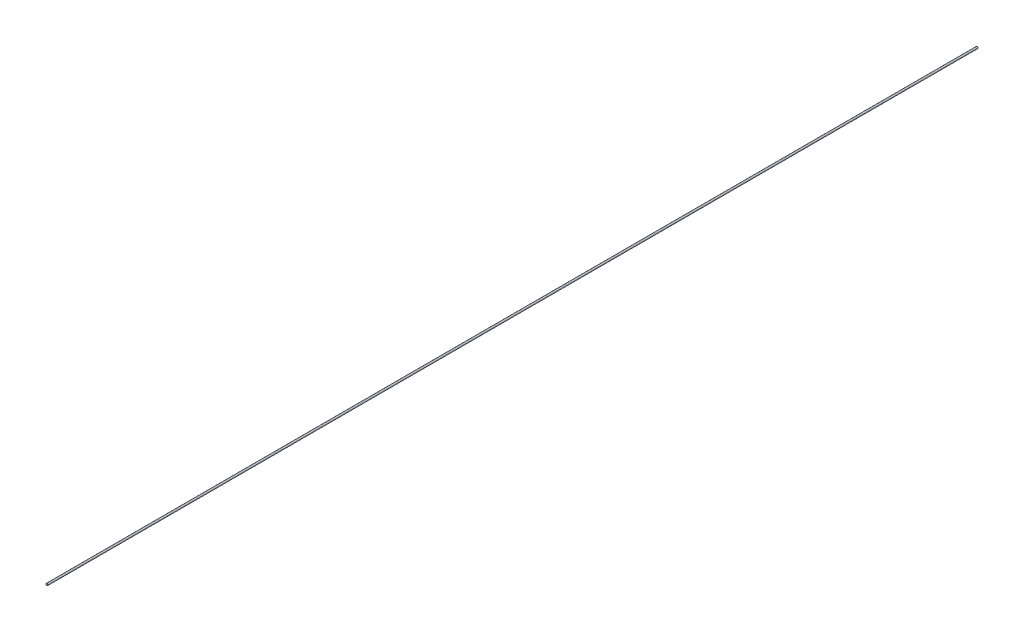
ISO-10303-21;
HEADER;
FILE_DESCRIPTION(('STEP AP214'),'2;1');
FILE_NAME('part.step','',(''),(''),'','','');
FILE_SCHEMA(('AUTOMOTIVE_DESIGN { 1 0 10303 214 1 1 1 1 }'));
ENDSEC;
DATA;
#1=APPLICATION_CONTEXT('core data for automotive mechanical design processes');
#2=APPLICATION_PROTOCOL_DEFINITION('international standard','automotive_design',2000,#1);
#3=PRODUCT_CONTEXT('',#1,'mechanical');
#4=PRODUCT('Part','Part','',(#3));
#5=PRODUCT_RELATED_PRODUCT_CATEGORY('part','',(#4));
#6=PRODUCT_DEFINITION_FORMATION('','',#4);
#7=PRODUCT_DEFINITION_CONTEXT('part definition',#1,'design');
#8=PRODUCT_DEFINITION('design','',#6,#7);
#9=PRODUCT_DEFINITION_SHAPE('','',#8);
#10=(LENGTH_UNIT() NAMED_UNIT(*) SI_UNIT(.MILLI.,.METRE.));
#11=(NAMED_UNIT(*) PLANE_ANGLE_UNIT() SI_UNIT($,.RADIAN.));
#12=(NAMED_UNIT(*) SI_UNIT($,.STERADIAN.) SOLID_ANGLE_UNIT());
#13=UNCERTAINTY_MEASURE_WITH_UNIT(LENGTH_MEASURE(1.E-05),#10,'distance_accuracy_value','');
#14=(GEOMETRIC_REPRESENTATION_CONTEXT(3) GLOBAL_UNCERTAINTY_ASSIGNED_CONTEXT((#13)) GLOBAL_UNIT_ASSIGNED_CONTEXT((#10,
#11,#12)) REPRESENTATION_CONTEXT('',''));
#15=CARTESIAN_POINT('',(0.,0.,0.));
#16=DIRECTION('',(0.,0.,1.));
#17=DIRECTION('',(1.,0.,0.));
#18=AXIS2_PLACEMENT_3D('',#15,#16,#17);
#19=CARTESIAN_POINT('',(0.,0.,40.));
#20=DIRECTION('',(0.,0.,-1.));
#21=DIRECTION('',(-1.,0.,0.));
#22=AXIS2_PLACEMENT_3D('',#19,#20,#21);
#23=CYLINDRICAL_SURFACE('',#22,0.04);
#24=CARTESIAN_POINT('',(0.,0.,40.));
#25=DIRECTION('',(0.,0.,1.));
#26=DIRECTION('',(1.,0.,0.));
#27=AXIS2_PLACEMENT_3D('',#24,#25,#26);
#28=CIRCLE('',#27,0.04);
#29=CARTESIAN_POINT('',(0.04,0.,40.));
#30=VERTEX_POINT('',#29);
#31=EDGE_CURVE('E10',#30,#30,#28,.T.);
#32=ORIENTED_EDGE('',*,*,#31,.F.);
#33=EDGE_LOOP('',(#32));
#34=FACE_BOUND('',#33,.T.);
#35=CARTESIAN_POINT('',(0.,0.,0.));
#36=DIRECTION('',(0.,0.,1.));
#37=DIRECTION('',(1.,0.,0.));
#38=AXIS2_PLACEMENT_3D('',#35,#36,#37);
#39=CIRCLE('',#38,0.04);
#40=CARTESIAN_POINT('',(0.04,0.,0.));
#41=VERTEX_POINT('',#40);
#42=EDGE_CURVE('E38',#41,#41,#39,.T.);
#43=ORIENTED_EDGE('',*,*,#42,.T.);
#44=EDGE_LOOP('',(#43));
#45=FACE_BOUND('',#44,.T.);
#46=ADVANCED_FACE('F35',(#34,#45),#23,.T.);
#47=CARTESIAN_POINT('',(0.,0.,40.));
#48=DIRECTION('',(0.,0.,1.));
#49=DIRECTION('',(1.,0.,0.));
#50=AXIS2_PLACEMENT_3D('',#47,#48,#49);
#51=PLANE('',#50);
#52=ORIENTED_EDGE('',*,*,#31,.T.);
#53=EDGE_LOOP('',(#52));
#54=FACE_BOUND('',#53,.T.);
#55=ADVANCED_FACE('F50',(#54),#51,.T.);
#56=CARTESIAN_POINT('',(0.,0.,0.));
#57=DIRECTION('',(0.,0.,1.));
#58=DIRECTION('',(1.,0.,0.));
#59=AXIS2_PLACEMENT_3D('',#56,#57,#58);
#60=PLANE('',#59);
#61=ORIENTED_EDGE('',*,*,#42,.F.);
#62=EDGE_LOOP('',(#61));
#63=FACE_BOUND('',#62,.T.);
#64=ADVANCED_FACE('F48',(#63),#60,.F.);
#65=CLOSED_SHELL('',(#46,#55,#64));
#66=MANIFOLD_SOLID_BREP('B2',#65);
#67=ADVANCED_BREP_SHAPE_REPRESENTATION('',(#18,#66),#14);
#68=SHAPE_DEFINITION_REPRESENTATION(#9,#67);
ENDSEC;
END-ISO-10303-21;
